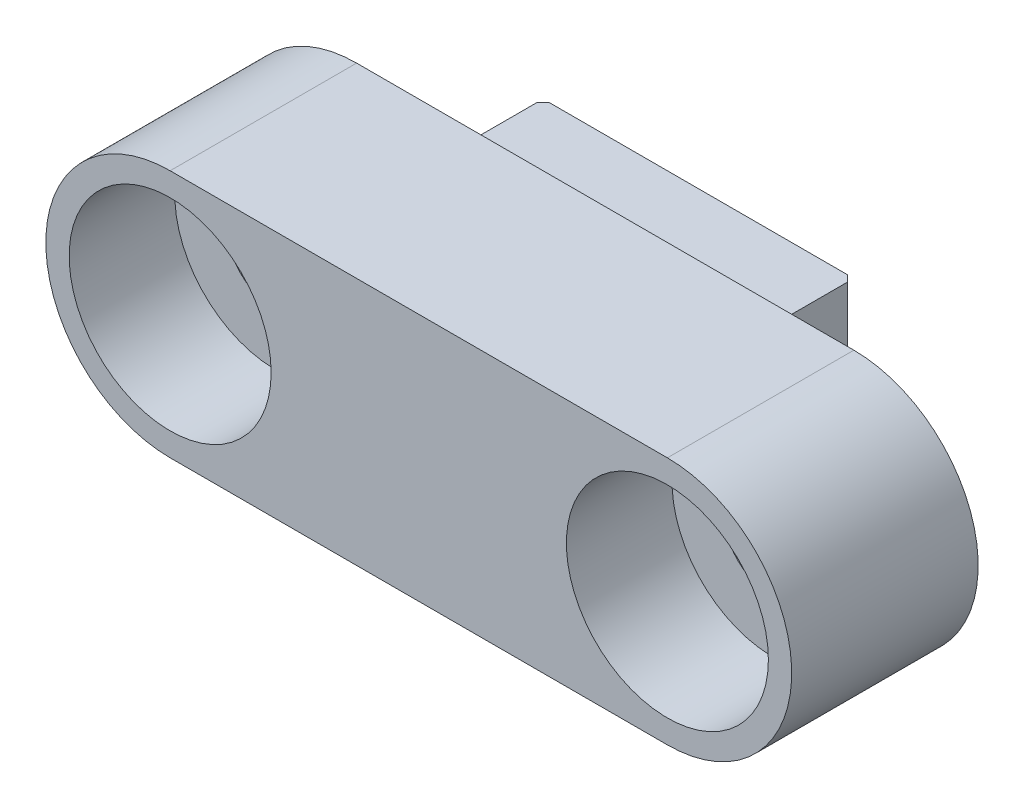
ISO-10303-21;
HEADER;
FILE_DESCRIPTION(('STEP AP214'),'2;1');
FILE_NAME('part.step','',(''),(''),'','','');
FILE_SCHEMA(('AUTOMOTIVE_DESIGN { 1 0 10303 214 1 1 1 1 }'));
ENDSEC;
DATA;
#1=APPLICATION_CONTEXT('core data for automotive mechanical design processes');
#2=APPLICATION_PROTOCOL_DEFINITION('international standard','automotive_design',2000,#1);
#3=PRODUCT_CONTEXT('',#1,'mechanical');
#4=PRODUCT('Part','Part','',(#3));
#5=PRODUCT_RELATED_PRODUCT_CATEGORY('part','',(#4));
#6=PRODUCT_DEFINITION_FORMATION('','',#4);
#7=PRODUCT_DEFINITION_CONTEXT('part definition',#1,'design');
#8=PRODUCT_DEFINITION('design','',#6,#7);
#9=PRODUCT_DEFINITION_SHAPE('','',#8);
#10=(LENGTH_UNIT() NAMED_UNIT(*) SI_UNIT(.MILLI.,.METRE.));
#11=(NAMED_UNIT(*) PLANE_ANGLE_UNIT() SI_UNIT($,.RADIAN.));
#12=(NAMED_UNIT(*) SI_UNIT($,.STERADIAN.) SOLID_ANGLE_UNIT());
#13=UNCERTAINTY_MEASURE_WITH_UNIT(LENGTH_MEASURE(1.E-05),#10,'distance_accuracy_value','');
#14=(GEOMETRIC_REPRESENTATION_CONTEXT(3) GLOBAL_UNCERTAINTY_ASSIGNED_CONTEXT((#13)) GLOBAL_UNIT_ASSIGNED_CONTEXT((#10,
#11,#12)) REPRESENTATION_CONTEXT('',''));
#15=CARTESIAN_POINT('',(0.,0.,0.));
#16=DIRECTION('',(0.,0.,1.));
#17=DIRECTION('',(1.,0.,0.));
#18=AXIS2_PLACEMENT_3D('',#15,#16,#17);
#19=CARTESIAN_POINT('',(-8.,0.,0.));
#20=DIRECTION('',(0.,0.,1.));
#21=DIRECTION('',(1.,0.,0.));
#22=AXIS2_PLACEMENT_3D('',#19,#20,#21);
#23=PLANE('',#22);
#24=CARTESIAN_POINT('',(8.,0.,0.));
#25=DIRECTION('',(0.,0.,1.));
#26=DIRECTION('',(1.,0.,0.));
#27=AXIS2_PLACEMENT_3D('',#24,#25,#26);
#28=CIRCLE('',#27,4.);
#29=CARTESIAN_POINT('',(8.,-4.,0.));
#30=VERTEX_POINT('',#29);
#31=CARTESIAN_POINT('',(8.,4.,0.));
#32=VERTEX_POINT('',#31);
#33=EDGE_CURVE('E191',#30,#32,#28,.T.);
#34=ORIENTED_EDGE('',*,*,#33,.F.);
#35=DIRECTION('',(1.,0.,0.));
#36=VECTOR('',#35,1.);
#37=CARTESIAN_POINT('',(-8.,-4.,0.));
#38=LINE('',#37,#36);
#39=CARTESIAN_POINT('',(-8.,-4.,0.));
#40=VERTEX_POINT('',#39);
#41=EDGE_CURVE('E139',#40,#30,#38,.T.);
#42=ORIENTED_EDGE('',*,*,#41,.F.);
#43=CARTESIAN_POINT('',(-8.,0.,0.));
#44=DIRECTION('',(0.,0.,1.));
#45=DIRECTION('',(1.,0.,0.));
#46=AXIS2_PLACEMENT_3D('',#43,#44,#45);
#47=CIRCLE('',#46,4.);
#48=CARTESIAN_POINT('',(-8.,4.,0.));
#49=VERTEX_POINT('',#48);
#50=EDGE_CURVE('E176',#49,#40,#47,.T.);
#51=ORIENTED_EDGE('',*,*,#50,.F.);
#52=DIRECTION('',(-1.,0.,0.));
#53=VECTOR('',#52,1.);
#54=CARTESIAN_POINT('',(-8.,4.,0.));
#55=LINE('',#54,#53);
#56=EDGE_CURVE('E181',#32,#49,#55,.T.);
#57=ORIENTED_EDGE('',*,*,#56,.F.);
#58=EDGE_LOOP('',(#34,#42,#51,#57));
#59=FACE_BOUND('',#58,.T.);
#60=CARTESIAN_POINT('',(-8.,0.,0.));
#61=DIRECTION('',(0.,0.,1.));
#62=DIRECTION('',(1.,0.,0.));
#63=AXIS2_PLACEMENT_3D('',#60,#61,#62);
#64=CIRCLE('',#63,1.6);
#65=CARTESIAN_POINT('',(-6.4,0.,0.));
#66=VERTEX_POINT('',#65);
#67=EDGE_CURVE('E161',#66,#66,#64,.T.);
#68=ORIENTED_EDGE('',*,*,#67,.T.);
#69=EDGE_LOOP('',(#68));
#70=FACE_BOUND('',#69,.T.);
#71=DIRECTION('',(0.,1.,0.));
#72=VECTOR('',#71,1.);
#73=CARTESIAN_POINT('',(-5.,4.,0.));
#74=LINE('',#73,#72);
#75=CARTESIAN_POINT('',(-5.,-3.,0.));
#76=VERTEX_POINT('',#75);
#77=CARTESIAN_POINT('',(-5.,3.,0.));
#78=VERTEX_POINT('',#77);
#79=EDGE_CURVE('E39',#76,#78,#74,.T.);
#80=ORIENTED_EDGE('',*,*,#79,.F.);
#81=DIRECTION('',(1.,0.,0.));
#82=VECTOR('',#81,1.);
#83=CARTESIAN_POINT('',(-12.001,-3.,0.));
#84=LINE('',#83,#82);
#85=CARTESIAN_POINT('',(5.,-3.,0.));
#86=VERTEX_POINT('',#85);
#87=EDGE_CURVE('E127',#76,#86,#84,.T.);
#88=ORIENTED_EDGE('',*,*,#87,.T.);
#89=DIRECTION('',(0.,-1.,0.));
#90=VECTOR('',#89,1.);
#91=CARTESIAN_POINT('',(5.,4.,0.));
#92=LINE('',#91,#90);
#93=CARTESIAN_POINT('',(5.,3.,0.));
#94=VERTEX_POINT('',#93);
#95=EDGE_CURVE('E143',#94,#86,#92,.T.);
#96=ORIENTED_EDGE('',*,*,#95,.F.);
#97=DIRECTION('',(1.,0.,0.));
#98=VECTOR('',#97,1.);
#99=CARTESIAN_POINT('',(-12.001,3.,0.));
#100=LINE('',#99,#98);
#101=EDGE_CURVE('E419',#78,#94,#100,.T.);
#102=ORIENTED_EDGE('',*,*,#101,.F.);
#103=EDGE_LOOP('',(#80,#88,#96,#102));
#104=FACE_BOUND('',#103,.T.);
#105=CARTESIAN_POINT('',(8.,0.,0.));
#106=DIRECTION('',(0.,0.,1.));
#107=DIRECTION('',(1.,0.,0.));
#108=AXIS2_PLACEMENT_3D('',#105,#106,#107);
#109=CIRCLE('',#108,1.6);
#110=CARTESIAN_POINT('',(9.6,0.,0.));
#111=VERTEX_POINT('',#110);
#112=EDGE_CURVE('E173',#111,#111,#109,.T.);
#113=ORIENTED_EDGE('',*,*,#112,.T.);
#114=EDGE_LOOP('',(#113));
#115=FACE_BOUND('',#114,.T.);
#116=ADVANCED_FACE('F35',(#59,#70,#104,#115),#23,.F.);
#117=CARTESIAN_POINT('',(-8.,0.,6.));
#118=DIRECTION('',(0.,0.,-1.));
#119=DIRECTION('',(-1.,0.,0.));
#120=AXIS2_PLACEMENT_3D('',#117,#118,#119);
#121=CYLINDRICAL_SURFACE('',#120,4.);
#122=ORIENTED_EDGE('',*,*,#50,.T.);
#123=DIRECTION('',(0.,0.,-1.));
#124=VECTOR('',#123,1.);
#125=CARTESIAN_POINT('',(-8.,-4.,6.));
#126=LINE('',#125,#124);
#127=CARTESIAN_POINT('',(-8.,-4.,6.));
#128=VERTEX_POINT('',#127);
#129=EDGE_CURVE('E132',#128,#40,#126,.T.);
#130=ORIENTED_EDGE('',*,*,#129,.F.);
#131=CARTESIAN_POINT('',(-8.,0.,6.));
#132=DIRECTION('',(0.,0.,1.));
#133=DIRECTION('',(1.,0.,0.));
#134=AXIS2_PLACEMENT_3D('',#131,#132,#133);
#135=CIRCLE('',#134,4.);
#136=CARTESIAN_POINT('',(-8.,4.,6.));
#137=VERTEX_POINT('',#136);
#138=EDGE_CURVE('E177',#137,#128,#135,.T.);
#139=ORIENTED_EDGE('',*,*,#138,.F.);
#140=DIRECTION('',(0.,0.,-1.));
#141=VECTOR('',#140,1.);
#142=CARTESIAN_POINT('',(-8.,4.,6.));
#143=LINE('',#142,#141);
#144=EDGE_CURVE('E187',#137,#49,#143,.T.);
#145=ORIENTED_EDGE('',*,*,#144,.T.);
#146=EDGE_LOOP('',(#122,#130,#139,#145));
#147=FACE_BOUND('',#146,.T.);
#148=ADVANCED_FACE('F209',(#147),#121,.T.);
#149=CARTESIAN_POINT('',(-8.,-4.,6.));
#150=DIRECTION('',(0.,1.,0.));
#151=DIRECTION('',(0.,0.,1.));
#152=AXIS2_PLACEMENT_3D('',#149,#150,#151);
#153=PLANE('',#152);
#154=ORIENTED_EDGE('',*,*,#41,.T.);
#155=DIRECTION('',(0.,0.,-1.));
#156=VECTOR('',#155,1.);
#157=CARTESIAN_POINT('',(8.,-4.,6.));
#158=LINE('',#157,#156);
#159=CARTESIAN_POINT('',(8.,-4.,6.));
#160=VERTEX_POINT('',#159);
#161=EDGE_CURVE('E136',#160,#30,#158,.T.);
#162=ORIENTED_EDGE('',*,*,#161,.F.);
#163=DIRECTION('',(1.,0.,0.));
#164=VECTOR('',#163,1.);
#165=CARTESIAN_POINT('',(-8.,-4.,6.));
#166=LINE('',#165,#164);
#167=EDGE_CURVE('E180',#128,#160,#166,.T.);
#168=ORIENTED_EDGE('',*,*,#167,.F.);
#169=ORIENTED_EDGE('',*,*,#129,.T.);
#170=EDGE_LOOP('',(#154,#162,#168,#169));
#171=FACE_BOUND('',#170,.T.);
#172=ADVANCED_FACE('F216',(#171),#153,.F.);
#173=CARTESIAN_POINT('',(8.,0.,6.));
#174=DIRECTION('',(0.,0.,-1.));
#175=DIRECTION('',(-1.,0.,0.));
#176=AXIS2_PLACEMENT_3D('',#173,#174,#175);
#177=CYLINDRICAL_SURFACE('',#176,4.);
#178=ORIENTED_EDGE('',*,*,#33,.T.);
#179=DIRECTION('',(0.,0.,-1.));
#180=VECTOR('',#179,1.);
#181=CARTESIAN_POINT('',(8.,4.,6.));
#182=LINE('',#181,#180);
#183=CARTESIAN_POINT('',(8.,4.,6.));
#184=VERTEX_POINT('',#183);
#185=EDGE_CURVE('E198',#184,#32,#182,.T.);
#186=ORIENTED_EDGE('',*,*,#185,.F.);
#187=CARTESIAN_POINT('',(8.,0.,6.));
#188=DIRECTION('',(0.,0.,1.));
#189=DIRECTION('',(1.,0.,0.));
#190=AXIS2_PLACEMENT_3D('',#187,#188,#189);
#191=CIRCLE('',#190,4.);
#192=EDGE_CURVE('E183',#160,#184,#191,.T.);
#193=ORIENTED_EDGE('',*,*,#192,.F.);
#194=ORIENTED_EDGE('',*,*,#161,.T.);
#195=EDGE_LOOP('',(#178,#186,#193,#194));
#196=FACE_BOUND('',#195,.T.);
#197=ADVANCED_FACE('F222',(#196),#177,.T.);
#198=CARTESIAN_POINT('',(-8.,4.,6.));
#199=DIRECTION('',(0.,-1.,0.));
#200=DIRECTION('',(0.,0.,-1.));
#201=AXIS2_PLACEMENT_3D('',#198,#199,#200);
#202=PLANE('',#201);
#203=ORIENTED_EDGE('',*,*,#56,.T.);
#204=ORIENTED_EDGE('',*,*,#144,.F.);
#205=DIRECTION('',(-1.,0.,0.));
#206=VECTOR('',#205,1.);
#207=CARTESIAN_POINT('',(-8.,4.,6.));
#208=LINE('',#207,#206);
#209=EDGE_CURVE('E185',#184,#137,#208,.T.);
#210=ORIENTED_EDGE('',*,*,#209,.F.);
#211=ORIENTED_EDGE('',*,*,#185,.T.);
#212=EDGE_LOOP('',(#203,#204,#210,#211));
#213=FACE_BOUND('',#212,.T.);
#214=ADVANCED_FACE('F220',(#213),#202,.F.);
#215=CARTESIAN_POINT('',(-8.,0.,6.));
#216=DIRECTION('',(0.,0.,1.));
#217=DIRECTION('',(1.,0.,0.));
#218=AXIS2_PLACEMENT_3D('',#215,#216,#217);
#219=PLANE('',#218);
#220=CARTESIAN_POINT('',(-8.,0.,6.));
#221=DIRECTION('',(0.,0.,1.));
#222=DIRECTION('',(1.,0.,0.));
#223=AXIS2_PLACEMENT_3D('',#220,#221,#222);
#224=CIRCLE('',#223,3.25);
#225=CARTESIAN_POINT('',(-4.75,0.,6.));
#226=VERTEX_POINT('',#225);
#227=EDGE_CURVE('E152',#226,#226,#224,.T.);
#228=ORIENTED_EDGE('',*,*,#227,.F.);
#229=EDGE_LOOP('',(#228));
#230=FACE_BOUND('',#229,.T.);
#231=CARTESIAN_POINT('',(8.,0.,6.));
#232=DIRECTION('',(0.,0.,1.));
#233=DIRECTION('',(1.,0.,0.));
#234=AXIS2_PLACEMENT_3D('',#231,#232,#233);
#235=CIRCLE('',#234,3.25);
#236=CARTESIAN_POINT('',(11.25,0.,6.));
#237=VERTEX_POINT('',#236);
#238=EDGE_CURVE('E164',#237,#237,#235,.T.);
#239=ORIENTED_EDGE('',*,*,#238,.F.);
#240=EDGE_LOOP('',(#239));
#241=FACE_BOUND('',#240,.T.);
#242=ORIENTED_EDGE('',*,*,#138,.T.);
#243=ORIENTED_EDGE('',*,*,#167,.T.);
#244=ORIENTED_EDGE('',*,*,#192,.T.);
#245=ORIENTED_EDGE('',*,*,#209,.T.);
#246=EDGE_LOOP('',(#242,#243,#244,#245));
#247=FACE_BOUND('',#246,.T.);
#248=ADVANCED_FACE('F219',(#230,#241,#247),#219,.T.);
#249=CARTESIAN_POINT('',(8.,0.,6.));
#250=DIRECTION('',(0.,0.,1.));
#251=DIRECTION('',(1.,0.,0.));
#252=AXIS2_PLACEMENT_3D('',#249,#250,#251);
#253=CYLINDRICAL_SURFACE('',#252,1.6);
#254=ORIENTED_EDGE('',*,*,#112,.F.);
#255=EDGE_LOOP('',(#254));
#256=FACE_BOUND('',#255,.T.);
#257=CARTESIAN_POINT('',(8.,0.,2.6));
#258=DIRECTION('',(0.,0.,1.));
#259=DIRECTION('',(1.,0.,0.));
#260=AXIS2_PLACEMENT_3D('',#257,#258,#259);
#261=CIRCLE('',#260,1.6);
#262=CARTESIAN_POINT('',(9.6,0.,2.6));
#263=VERTEX_POINT('',#262);
#264=EDGE_CURVE('E170',#263,#263,#261,.T.);
#265=ORIENTED_EDGE('',*,*,#264,.T.);
#266=EDGE_LOOP('',(#265));
#267=FACE_BOUND('',#266,.T.);
#268=ADVANCED_FACE('F228',(#256,#267),#253,.F.);
#269=CARTESIAN_POINT('',(9.6,0.,2.6));
#270=DIRECTION('',(0.,0.,-1.));
#271=DIRECTION('',(-1.,0.,0.));
#272=AXIS2_PLACEMENT_3D('',#269,#270,#271);
#273=PLANE('',#272);
#274=ORIENTED_EDGE('',*,*,#264,.F.);
#275=EDGE_LOOP('',(#274));
#276=FACE_BOUND('',#275,.T.);
#277=CARTESIAN_POINT('',(8.,0.,2.6));
#278=DIRECTION('',(0.,0.,1.));
#279=DIRECTION('',(1.,0.,0.));
#280=AXIS2_PLACEMENT_3D('',#277,#278,#279);
#281=CIRCLE('',#280,3.25);
#282=CARTESIAN_POINT('',(11.25,0.,2.6));
#283=VERTEX_POINT('',#282);
#284=EDGE_CURVE('E167',#283,#283,#281,.T.);
#285=ORIENTED_EDGE('',*,*,#284,.T.);
#286=EDGE_LOOP('',(#285));
#287=FACE_BOUND('',#286,.T.);
#288=ADVANCED_FACE('F242',(#276,#287),#273,.F.);
#289=CARTESIAN_POINT('',(8.,0.,6.));
#290=DIRECTION('',(0.,0.,1.));
#291=DIRECTION('',(1.,0.,0.));
#292=AXIS2_PLACEMENT_3D('',#289,#290,#291);
#293=CYLINDRICAL_SURFACE('',#292,3.25);
#294=ORIENTED_EDGE('',*,*,#284,.F.);
#295=EDGE_LOOP('',(#294));
#296=FACE_BOUND('',#295,.T.);
#297=ORIENTED_EDGE('',*,*,#238,.T.);
#298=EDGE_LOOP('',(#297));
#299=FACE_BOUND('',#298,.T.);
#300=ADVANCED_FACE('F246',(#296,#299),#293,.F.);
#301=CARTESIAN_POINT('',(-8.,0.,6.));
#302=DIRECTION('',(0.,0.,1.));
#303=DIRECTION('',(1.,0.,0.));
#304=AXIS2_PLACEMENT_3D('',#301,#302,#303);
#305=CYLINDRICAL_SURFACE('',#304,1.6);
#306=ORIENTED_EDGE('',*,*,#67,.F.);
#307=EDGE_LOOP('',(#306));
#308=FACE_BOUND('',#307,.T.);
#309=CARTESIAN_POINT('',(-8.,0.,2.6));
#310=DIRECTION('',(0.,0.,1.));
#311=DIRECTION('',(1.,0.,0.));
#312=AXIS2_PLACEMENT_3D('',#309,#310,#311);
#313=CIRCLE('',#312,1.6);
#314=CARTESIAN_POINT('',(-6.4,0.,2.6));
#315=VERTEX_POINT('',#314);
#316=EDGE_CURVE('E158',#315,#315,#313,.T.);
#317=ORIENTED_EDGE('',*,*,#316,.T.);
#318=EDGE_LOOP('',(#317));
#319=FACE_BOUND('',#318,.T.);
#320=ADVANCED_FACE('F250',(#308,#319),#305,.F.);
#321=CARTESIAN_POINT('',(-6.4,0.,2.6));
#322=DIRECTION('',(0.,0.,-1.));
#323=DIRECTION('',(-1.,0.,0.));
#324=AXIS2_PLACEMENT_3D('',#321,#322,#323);
#325=PLANE('',#324);
#326=ORIENTED_EDGE('',*,*,#316,.F.);
#327=EDGE_LOOP('',(#326));
#328=FACE_BOUND('',#327,.T.);
#329=CARTESIAN_POINT('',(-8.,0.,2.6));
#330=DIRECTION('',(0.,0.,1.));
#331=DIRECTION('',(1.,0.,0.));
#332=AXIS2_PLACEMENT_3D('',#329,#330,#331);
#333=CIRCLE('',#332,3.25);
#334=CARTESIAN_POINT('',(-4.75,0.,2.6));
#335=VERTEX_POINT('',#334);
#336=EDGE_CURVE('E155',#335,#335,#333,.T.);
#337=ORIENTED_EDGE('',*,*,#336,.T.);
#338=EDGE_LOOP('',(#337));
#339=FACE_BOUND('',#338,.T.);
#340=ADVANCED_FACE('F254',(#328,#339),#325,.F.);
#341=CARTESIAN_POINT('',(-8.,0.,6.));
#342=DIRECTION('',(0.,0.,1.));
#343=DIRECTION('',(1.,0.,0.));
#344=AXIS2_PLACEMENT_3D('',#341,#342,#343);
#345=CYLINDRICAL_SURFACE('',#344,3.25);
#346=ORIENTED_EDGE('',*,*,#336,.F.);
#347=EDGE_LOOP('',(#346));
#348=FACE_BOUND('',#347,.T.);
#349=ORIENTED_EDGE('',*,*,#227,.T.);
#350=EDGE_LOOP('',(#349));
#351=FACE_BOUND('',#350,.T.);
#352=ADVANCED_FACE('F258',(#348,#351),#345,.F.);
#353=CARTESIAN_POINT('',(5.,4.,-3.));
#354=DIRECTION('',(-1.,0.,0.));
#355=DIRECTION('',(0.,-1.,0.));
#356=AXIS2_PLACEMENT_3D('',#353,#354,#355);
#357=PLANE('',#356);
#358=ORIENTED_EDGE('',*,*,#95,.T.);
#359=DIRECTION('',(0.,0.,1.));
#360=VECTOR('',#359,1.);
#361=CARTESIAN_POINT('',(5.,-3.,0.));
#362=LINE('',#361,#360);
#363=CARTESIAN_POINT('',(5.,-3.,-2.8));
#364=VERTEX_POINT('',#363);
#365=EDGE_CURVE('E128',#364,#86,#362,.T.);
#366=ORIENTED_EDGE('',*,*,#365,.F.);
#367=DIRECTION('',(0.,1.,0.));
#368=VECTOR('',#367,1.);
#369=CARTESIAN_POINT('',(5.,4.,-2.8));
#370=LINE('',#369,#368);
#371=CARTESIAN_POINT('',(5.,3.,-2.8));
#372=VERTEX_POINT('',#371);
#373=EDGE_CURVE('E45',#364,#372,#370,.T.);
#374=ORIENTED_EDGE('',*,*,#373,.T.);
#375=DIRECTION('',(0.,0.,-1.));
#376=VECTOR('',#375,1.);
#377=CARTESIAN_POINT('',(5.,3.,0.));
#378=LINE('',#377,#376);
#379=EDGE_CURVE('E416',#94,#372,#378,.T.);
#380=ORIENTED_EDGE('',*,*,#379,.F.);
#381=EDGE_LOOP('',(#358,#366,#374,#380));
#382=FACE_BOUND('',#381,.T.);
#383=ADVANCED_FACE('F262',(#382),#357,.F.);
#384=CARTESIAN_POINT('',(-5.,4.,-3.));
#385=DIRECTION('',(1.,0.,0.));
#386=DIRECTION('',(0.,1.,0.));
#387=AXIS2_PLACEMENT_3D('',#384,#385,#386);
#388=PLANE('',#387);
#389=DIRECTION('',(0.,-1.,0.));
#390=VECTOR('',#389,1.);
#391=CARTESIAN_POINT('',(-5.,-4.,-2.8));
#392=LINE('',#391,#390);
#393=CARTESIAN_POINT('',(-5.,3.,-2.8));
#394=VERTEX_POINT('',#393);
#395=CARTESIAN_POINT('',(-5.,-3.,-2.8));
#396=VERTEX_POINT('',#395);
#397=EDGE_CURVE('E11',#394,#396,#392,.T.);
#398=ORIENTED_EDGE('',*,*,#397,.T.);
#399=DIRECTION('',(0.,0.,-1.));
#400=VECTOR('',#399,1.);
#401=CARTESIAN_POINT('',(-5.,-3.,0.));
#402=LINE('',#401,#400);
#403=EDGE_CURVE('E53',#76,#396,#402,.T.);
#404=ORIENTED_EDGE('',*,*,#403,.F.);
#405=ORIENTED_EDGE('',*,*,#79,.T.);
#406=DIRECTION('',(0.,0.,1.));
#407=VECTOR('',#406,1.);
#408=CARTESIAN_POINT('',(-5.,3.,0.));
#409=LINE('',#408,#407);
#410=EDGE_CURVE('E146',#394,#78,#409,.T.);
#411=ORIENTED_EDGE('',*,*,#410,.F.);
#412=EDGE_LOOP('',(#398,#404,#405,#411));
#413=FACE_BOUND('',#412,.T.);
#414=ADVANCED_FACE('F266',(#413),#388,.F.);
#415=CARTESIAN_POINT('',(0.,0.,-3.));
#416=DIRECTION('',(0.,0.,-1.));
#417=DIRECTION('',(-1.,0.,0.));
#418=AXIS2_PLACEMENT_3D('',#415,#416,#417);
#419=PLANE('',#418);
#420=DIRECTION('',(1.,0.,0.));
#421=VECTOR('',#420,1.);
#422=CARTESIAN_POINT('',(-12.001,-3.,-3.));
#423=LINE('',#422,#421);
#424=CARTESIAN_POINT('',(-4.8,-3.,-3.));
#425=VERTEX_POINT('',#424);
#426=CARTESIAN_POINT('',(4.80000000000001,-3.,-3.));
#427=VERTEX_POINT('',#426);
#428=EDGE_CURVE('E117',#425,#427,#423,.T.);
#429=ORIENTED_EDGE('',*,*,#428,.F.);
#430=DIRECTION('',(0.,1.,0.));
#431=VECTOR('',#430,1.);
#432=CARTESIAN_POINT('',(-4.8,4.,-3.));
#433=LINE('',#432,#431);
#434=CARTESIAN_POINT('',(-4.8,3.,-3.));
#435=VERTEX_POINT('',#434);
#436=EDGE_CURVE('E61',#425,#435,#433,.T.);
#437=ORIENTED_EDGE('',*,*,#436,.T.);
#438=DIRECTION('',(1.,0.,0.));
#439=VECTOR('',#438,1.);
#440=CARTESIAN_POINT('',(-12.001,3.,-3.));
#441=LINE('',#440,#439);
#442=CARTESIAN_POINT('',(4.80000000000001,3.,-3.));
#443=VERTEX_POINT('',#442);
#444=EDGE_CURVE('E420',#435,#443,#441,.T.);
#445=ORIENTED_EDGE('',*,*,#444,.T.);
#446=DIRECTION('',(0.,-1.,0.));
#447=VECTOR('',#446,1.);
#448=CARTESIAN_POINT('',(4.80000000000001,-4.,-3.));
#449=LINE('',#448,#447);
#450=EDGE_CURVE('E126',#443,#427,#449,.T.);
#451=ORIENTED_EDGE('',*,*,#450,.T.);
#452=EDGE_LOOP('',(#429,#437,#445,#451));
#453=FACE_BOUND('',#452,.T.);
#454=ADVANCED_FACE('F124',(#453),#419,.T.);
#455=CARTESIAN_POINT('',(4.80000000000001,0.,-3.));
#456=DIRECTION('',(0.707106781186554,0.,-0.70710678118654));
#457=DIRECTION('',(0.,1.,0.));
#458=AXIS2_PLACEMENT_3D('',#455,#456,#457);
#459=PLANE('',#458);
#460=DIRECTION('',(-0.707106781186541,0.,-0.707106781186554));
#461=VECTOR('',#460,1.);
#462=CARTESIAN_POINT('',(-2.10049999999983,-3.,-9.90049999999997));
#463=LINE('',#462,#461);
#464=EDGE_CURVE('E121',#364,#427,#463,.T.);
#465=ORIENTED_EDGE('',*,*,#464,.T.);
#466=ORIENTED_EDGE('',*,*,#450,.F.);
#467=DIRECTION('',(0.707106781186541,0.,0.707106781186554));
#468=VECTOR('',#467,1.);
#469=CARTESIAN_POINT('',(-2.10049999999983,3.,-9.90049999999997));
#470=LINE('',#469,#468);
#471=EDGE_CURVE('E413',#443,#372,#470,.T.);
#472=ORIENTED_EDGE('',*,*,#471,.T.);
#473=ORIENTED_EDGE('',*,*,#373,.F.);
#474=EDGE_LOOP('',(#465,#466,#472,#473));
#475=FACE_BOUND('',#474,.T.);
#476=ADVANCED_FACE('F273',(#475),#459,.T.);
#477=CARTESIAN_POINT('',(-4.8,0.,-3.));
#478=DIRECTION('',(-0.707106781186553,0.,-0.707106781186542));
#479=DIRECTION('',(0.,-1.,0.));
#480=AXIS2_PLACEMENT_3D('',#477,#478,#479);
#481=PLANE('',#480);
#482=DIRECTION('',(-0.707106781186542,0.,0.707106781186553));
#483=VECTOR('',#482,1.);
#484=CARTESIAN_POINT('',(-9.90049999999995,-3.,2.10050000000002));
#485=LINE('',#484,#483);
#486=EDGE_CURVE('E114',#425,#396,#485,.T.);
#487=ORIENTED_EDGE('',*,*,#486,.T.);
#488=ORIENTED_EDGE('',*,*,#397,.F.);
#489=DIRECTION('',(0.707106781186542,0.,-0.707106781186553));
#490=VECTOR('',#489,1.);
#491=CARTESIAN_POINT('',(-9.90049999999995,3.,2.10050000000002));
#492=LINE('',#491,#490);
#493=EDGE_CURVE('E131',#394,#435,#492,.T.);
#494=ORIENTED_EDGE('',*,*,#493,.T.);
#495=ORIENTED_EDGE('',*,*,#436,.F.);
#496=EDGE_LOOP('',(#487,#488,#494,#495));
#497=FACE_BOUND('',#496,.T.);
#498=ADVANCED_FACE('F37',(#497),#481,.T.);
#499=CARTESIAN_POINT('',(-12.001,3.,0.));
#500=DIRECTION('',(0.,-1.,0.));
#501=DIRECTION('',(1.,0.,0.));
#502=AXIS2_PLACEMENT_3D('',#499,#500,#501);
#503=PLANE('',#502);
#504=ORIENTED_EDGE('',*,*,#444,.F.);
#505=ORIENTED_EDGE('',*,*,#493,.F.);
#506=ORIENTED_EDGE('',*,*,#410,.T.);
#507=ORIENTED_EDGE('',*,*,#101,.T.);
#508=ORIENTED_EDGE('',*,*,#379,.T.);
#509=ORIENTED_EDGE('',*,*,#471,.F.);
#510=EDGE_LOOP('',(#504,#505,#506,#507,#508,#509));
#511=FACE_BOUND('',#510,.T.);
#512=ADVANCED_FACE('F274',(#511),#503,.F.);
#513=CARTESIAN_POINT('',(-12.001,-3.,0.));
#514=DIRECTION('',(0.,1.,0.));
#515=DIRECTION('',(-1.,0.,0.));
#516=AXIS2_PLACEMENT_3D('',#513,#514,#515);
#517=PLANE('',#516);
#518=ORIENTED_EDGE('',*,*,#365,.T.);
#519=ORIENTED_EDGE('',*,*,#87,.F.);
#520=ORIENTED_EDGE('',*,*,#403,.T.);
#521=ORIENTED_EDGE('',*,*,#486,.F.);
#522=ORIENTED_EDGE('',*,*,#428,.T.);
#523=ORIENTED_EDGE('',*,*,#464,.F.);
#524=EDGE_LOOP('',(#518,#519,#520,#521,#522,#523));
#525=FACE_BOUND('',#524,.T.);
#526=ADVANCED_FACE('F116',(#525),#517,.F.);
#527=CLOSED_SHELL('',(#116,#148,#172,#197,#214,#248,#268,#288,#300,#320,#340,#352,#383,#414,
#454,#476,#498,#512,#526));
#528=MANIFOLD_SOLID_BREP('B2',#527);
#529=ADVANCED_BREP_SHAPE_REPRESENTATION('',(#18,#528),#14);
#530=SHAPE_DEFINITION_REPRESENTATION(#9,#529);
ENDSEC;
END-ISO-10303-21;
